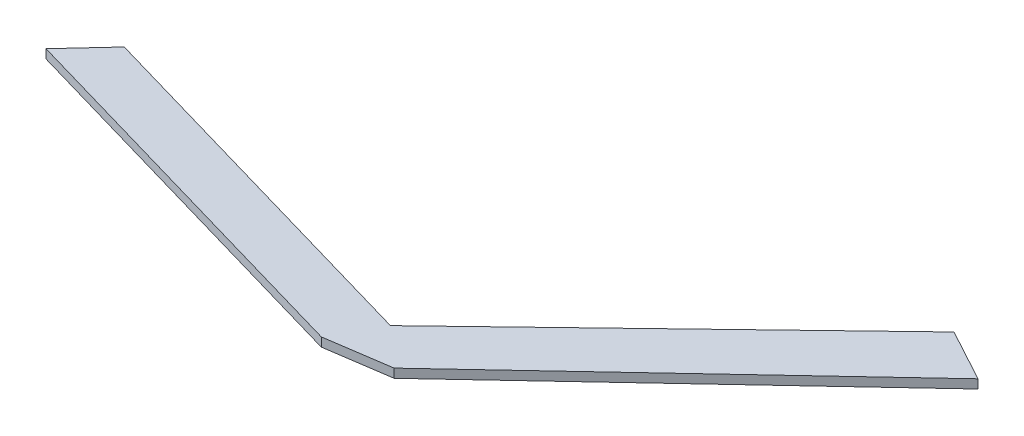
ISO-10303-21;
HEADER;
FILE_DESCRIPTION(('STEP AP214'),'2;1');
FILE_NAME('part.step','',(''),(''),'','','');
FILE_SCHEMA(('AUTOMOTIVE_DESIGN { 1 0 10303 214 1 1 1 1 }'));
ENDSEC;
DATA;
#1=APPLICATION_CONTEXT('core data for automotive mechanical design processes');
#2=APPLICATION_PROTOCOL_DEFINITION('international standard','automotive_design',2000,#1);
#3=PRODUCT_CONTEXT('',#1,'mechanical');
#4=PRODUCT('Part','Part','',(#3));
#5=PRODUCT_RELATED_PRODUCT_CATEGORY('part','',(#4));
#6=PRODUCT_DEFINITION_FORMATION('','',#4);
#7=PRODUCT_DEFINITION_CONTEXT('part definition',#1,'design');
#8=PRODUCT_DEFINITION('design','',#6,#7);
#9=PRODUCT_DEFINITION_SHAPE('','',#8);
#10=(LENGTH_UNIT() NAMED_UNIT(*) SI_UNIT(.MILLI.,.METRE.));
#11=(NAMED_UNIT(*) PLANE_ANGLE_UNIT() SI_UNIT($,.RADIAN.));
#12=(NAMED_UNIT(*) SI_UNIT($,.STERADIAN.) SOLID_ANGLE_UNIT());
#13=UNCERTAINTY_MEASURE_WITH_UNIT(LENGTH_MEASURE(1.E-05),#10,'distance_accuracy_value','');
#14=(GEOMETRIC_REPRESENTATION_CONTEXT(3) GLOBAL_UNCERTAINTY_ASSIGNED_CONTEXT((#13)) GLOBAL_UNIT_ASSIGNED_CONTEXT((#10,
#11,#12)) REPRESENTATION_CONTEXT('',''));
#15=CARTESIAN_POINT('',(0.,0.,0.));
#16=DIRECTION('',(0.,0.,1.));
#17=DIRECTION('',(1.,0.,0.));
#18=AXIS2_PLACEMENT_3D('',#15,#16,#17);
#19=CARTESIAN_POINT('',(32.4366791918596,1.,-31.1907332873785));
#20=DIRECTION('',(0.693127406386189,0.,0.720815093152436));
#21=DIRECTION('',(0.720815093152436,0.,-0.693127406386189));
#22=AXIS2_PLACEMENT_3D('',#19,#20,#21);
#23=PLANE('',#22);
#24=DIRECTION('',(-0.720815093152436,0.,0.693127406386189));
#25=VECTOR('',#24,1.);
#26=CARTESIAN_POINT('',(32.4366791918596,0.,-31.1907332873785));
#27=LINE('',#26,#25);
#28=CARTESIAN_POINT('',(32.4366791918596,0.,-31.1907332873785));
#29=VERTEX_POINT('',#28);
#30=CARTESIAN_POINT('',(0.,0.,0.));
#31=VERTEX_POINT('',#30);
#32=EDGE_CURVE('E134',#29,#31,#27,.T.);
#33=ORIENTED_EDGE('',*,*,#32,.T.);
#34=DIRECTION('',(0.,-1.,0.));
#35=VECTOR('',#34,1.);
#36=CARTESIAN_POINT('',(0.,1.,0.));
#37=LINE('',#36,#35);
#38=CARTESIAN_POINT('',(0.,1.,0.));
#39=VERTEX_POINT('',#38);
#40=EDGE_CURVE('E11',#39,#31,#37,.T.);
#41=ORIENTED_EDGE('',*,*,#40,.F.);
#42=DIRECTION('',(-0.720815093152436,0.,0.693127406386189));
#43=VECTOR('',#42,1.);
#44=CARTESIAN_POINT('',(32.4366791918596,1.,-31.1907332873785));
#45=LINE('',#44,#43);
#46=CARTESIAN_POINT('',(32.4366791918596,1.,-31.1907332873785));
#47=VERTEX_POINT('',#46);
#48=EDGE_CURVE('E153',#47,#39,#45,.T.);
#49=ORIENTED_EDGE('',*,*,#48,.F.);
#50=DIRECTION('',(0.,-1.,0.));
#51=VECTOR('',#50,1.);
#52=CARTESIAN_POINT('',(32.4366791918596,1.,-31.1907332873785));
#53=LINE('',#52,#51);
#54=EDGE_CURVE('E130',#47,#29,#53,.T.);
#55=ORIENTED_EDGE('',*,*,#54,.T.);
#56=EDGE_LOOP('',(#33,#41,#49,#55));
#57=FACE_BOUND('',#56,.T.);
#58=ADVANCED_FACE('F39',(#57),#23,.F.);
#59=CARTESIAN_POINT('',(0.,1.,0.));
#60=DIRECTION('',(-0.277680478908164,0.,0.960673488565877));
#61=DIRECTION('',(0.960673488565877,0.,0.277680478908164));
#62=AXIS2_PLACEMENT_3D('',#59,#60,#61);
#63=PLANE('',#62);
#64=DIRECTION('',(-0.960673488565877,0.,-0.277680478908164));
#65=VECTOR('',#64,1.);
#66=CARTESIAN_POINT('',(0.,0.,0.));
#67=LINE('',#66,#65);
#68=CARTESIAN_POINT('',(-42.2696334968991,0.,-12.2179410719593));
#69=VERTEX_POINT('',#68);
#70=EDGE_CURVE('E138',#31,#69,#67,.T.);
#71=ORIENTED_EDGE('',*,*,#70,.T.);
#72=DIRECTION('',(0.,-1.,0.));
#73=VECTOR('',#72,1.);
#74=CARTESIAN_POINT('',(-42.2696334968991,1.,-12.2179410719593));
#75=LINE('',#74,#73);
#76=CARTESIAN_POINT('',(-42.2696334968991,1.,-12.2179410719593));
#77=VERTEX_POINT('',#76);
#78=EDGE_CURVE('E48',#77,#69,#75,.T.);
#79=ORIENTED_EDGE('',*,*,#78,.F.);
#80=DIRECTION('',(-0.960673488565877,0.,-0.277680478908164));
#81=VECTOR('',#80,1.);
#82=CARTESIAN_POINT('',(0.,1.,0.));
#83=LINE('',#82,#81);
#84=EDGE_CURVE('E96',#39,#77,#83,.T.);
#85=ORIENTED_EDGE('',*,*,#84,.F.);
#86=ORIENTED_EDGE('',*,*,#40,.T.);
#87=EDGE_LOOP('',(#71,#79,#85,#86));
#88=FACE_BOUND('',#87,.T.);
#89=ADVANCED_FACE('F187',(#88),#63,.F.);
#90=CARTESIAN_POINT('',(-42.2696334968991,1.,-12.2179410719593));
#91=DIRECTION('',(0.733523655651934,0.,0.679663921801815));
#92=DIRECTION('',(0.679663921801815,0.,-0.733523655651934));
#93=AXIS2_PLACEMENT_3D('',#90,#91,#92);
#94=PLANE('',#93);
#95=DIRECTION('',(-0.679663921801815,0.,0.733523655651934));
#96=VECTOR('',#95,1.);
#97=CARTESIAN_POINT('',(-42.2696334968991,0.,-12.2179410719593));
#98=LINE('',#97,#96);
#99=CARTESIAN_POINT('',(-46.5175330081604,0.,-7.63341822413478));
#100=VERTEX_POINT('',#99);
#101=EDGE_CURVE('E141',#69,#100,#98,.T.);
#102=ORIENTED_EDGE('',*,*,#101,.T.);
#103=DIRECTION('',(0.,-1.,0.));
#104=VECTOR('',#103,1.);
#105=CARTESIAN_POINT('',(-46.5175330081604,1.,-7.63341822413478));
#106=LINE('',#105,#104);
#107=CARTESIAN_POINT('',(-46.5175330081604,1.,-7.63341822413478));
#108=VERTEX_POINT('',#107);
#109=EDGE_CURVE('E160',#108,#100,#106,.T.);
#110=ORIENTED_EDGE('',*,*,#109,.F.);
#111=DIRECTION('',(-0.679663921801815,0.,0.733523655651934));
#112=VECTOR('',#111,1.);
#113=CARTESIAN_POINT('',(-42.2696334968991,1.,-12.2179410719593));
#114=LINE('',#113,#112);
#115=EDGE_CURVE('E170',#77,#108,#114,.T.);
#116=ORIENTED_EDGE('',*,*,#115,.F.);
#117=ORIENTED_EDGE('',*,*,#78,.T.);
#118=EDGE_LOOP('',(#102,#110,#116,#117));
#119=FACE_BOUND('',#118,.T.);
#120=ADVANCED_FACE('F168',(#119),#94,.F.);
#121=CARTESIAN_POINT('',(-46.5175330081604,1.,-7.63341822413478));
#122=DIRECTION('',(0.277680478908164,0.,-0.960673488565877));
#123=DIRECTION('',(-0.960673488565878,0.,-0.277680478908164));
#124=AXIS2_PLACEMENT_3D('',#121,#122,#123);
#125=PLANE('',#124);
#126=DIRECTION('',(0.960673488565877,0.,0.277680478908164));
#127=VECTOR('',#126,1.);
#128=CARTESIAN_POINT('',(-46.5175330081604,0.,-7.63341822413478));
#129=LINE('',#128,#127);
#130=CARTESIAN_POINT('',(-2.80688927841294,0.,5.00104356618667));
#131=VERTEX_POINT('',#130);
#132=EDGE_CURVE('E144',#100,#131,#129,.T.);
#133=ORIENTED_EDGE('',*,*,#132,.T.);
#134=DIRECTION('',(0.,-1.,0.));
#135=VECTOR('',#134,1.);
#136=CARTESIAN_POINT('',(-2.80688927841294,1.,5.00104356618667));
#137=LINE('',#136,#135);
#138=CARTESIAN_POINT('',(-2.80688927841294,1.,5.00104356618667));
#139=VERTEX_POINT('',#138);
#140=EDGE_CURVE('E123',#139,#131,#137,.T.);
#141=ORIENTED_EDGE('',*,*,#140,.F.);
#142=DIRECTION('',(0.960673488565877,0.,0.277680478908164));
#143=VECTOR('',#142,1.);
#144=CARTESIAN_POINT('',(-46.5175330081604,1.,-7.63341822413478));
#145=LINE('',#144,#143);
#146=EDGE_CURVE('E112',#108,#139,#145,.T.);
#147=ORIENTED_EDGE('',*,*,#146,.F.);
#148=ORIENTED_EDGE('',*,*,#109,.T.);
#149=EDGE_LOOP('',(#133,#141,#147,#148));
#150=FACE_BOUND('',#149,.T.);
#151=ADVANCED_FACE('F176',(#150),#125,.F.);
#152=CARTESIAN_POINT('',(-2.80688927841294,1.,5.00104356618667));
#153=DIRECTION('',(-0.146461513389534,0.,-0.989216369201221));
#154=DIRECTION('',(-0.989216369201221,0.,0.146461513389534));
#155=AXIS2_PLACEMENT_3D('',#152,#153,#154);
#156=PLANE('',#155);
#157=DIRECTION('',(0.989216369201221,0.,-0.146461513389534));
#158=VECTOR('',#157,1.);
#159=CARTESIAN_POINT('',(-2.80688927841294,0.,5.00104356618667));
#160=LINE('',#159,#158);
#161=CARTESIAN_POINT('',(4.36492939829591,0.,3.93919759411254));
#162=VERTEX_POINT('',#161);
#163=EDGE_CURVE('E121',#131,#162,#160,.T.);
#164=ORIENTED_EDGE('',*,*,#163,.T.);
#165=DIRECTION('',(0.,-1.,0.));
#166=VECTOR('',#165,1.);
#167=CARTESIAN_POINT('',(4.36492939829591,1.,3.93919759411254));
#168=LINE('',#167,#166);
#169=CARTESIAN_POINT('',(4.36492939829591,1.,3.93919759411254));
#170=VERTEX_POINT('',#169);
#171=EDGE_CURVE('E118',#170,#162,#168,.T.);
#172=ORIENTED_EDGE('',*,*,#171,.F.);
#173=DIRECTION('',(0.989216369201221,0.,-0.146461513389534));
#174=VECTOR('',#173,1.);
#175=CARTESIAN_POINT('',(-2.80688927841294,1.,5.00104356618667));
#176=LINE('',#175,#174);
#177=EDGE_CURVE('E106',#139,#170,#176,.T.);
#178=ORIENTED_EDGE('',*,*,#177,.F.);
#179=ORIENTED_EDGE('',*,*,#140,.T.);
#180=EDGE_LOOP('',(#164,#172,#178,#179));
#181=FACE_BOUND('',#180,.T.);
#182=ADVANCED_FACE('F119',(#181),#156,.F.);
#183=CARTESIAN_POINT('',(4.36492939829591,1.,3.93919759411254));
#184=DIRECTION('',(-0.684285050171166,0.,-0.729214625547407));
#185=DIRECTION('',(-0.729214625547407,0.,0.684285050171166));
#186=AXIS2_PLACEMENT_3D('',#183,#184,#185);
#187=PLANE('',#186);
#188=DIRECTION('',(0.729214625547407,0.,-0.684285050171166));
#189=VECTOR('',#188,1.);
#190=CARTESIAN_POINT('',(4.36492939829591,0.,3.93919759411254));
#191=LINE('',#190,#189);
#192=CARTESIAN_POINT('',(38.3682073875715,0.,-27.9690142953689));
#193=VERTEX_POINT('',#192);
#194=EDGE_CURVE('E82',#162,#193,#191,.T.);
#195=ORIENTED_EDGE('',*,*,#194,.T.);
#196=DIRECTION('',(0.,-1.,0.));
#197=VECTOR('',#196,1.);
#198=CARTESIAN_POINT('',(38.3682073875715,1.,-27.9690142953689));
#199=LINE('',#198,#197);
#200=CARTESIAN_POINT('',(38.3682073875715,1.,-27.9690142953689));
#201=VERTEX_POINT('',#200);
#202=EDGE_CURVE('E124',#201,#193,#199,.T.);
#203=ORIENTED_EDGE('',*,*,#202,.F.);
#204=DIRECTION('',(0.729214625547407,0.,-0.684285050171166));
#205=VECTOR('',#204,1.);
#206=CARTESIAN_POINT('',(4.36492939829591,1.,3.93919759411254));
#207=LINE('',#206,#205);
#208=EDGE_CURVE('E110',#170,#201,#207,.T.);
#209=ORIENTED_EDGE('',*,*,#208,.F.);
#210=ORIENTED_EDGE('',*,*,#171,.T.);
#211=EDGE_LOOP('',(#195,#203,#209,#210));
#212=FACE_BOUND('',#211,.T.);
#213=ADVANCED_FACE('F126',(#212),#187,.F.);
#214=CARTESIAN_POINT('',(38.3682073875715,1.,-27.9690142953689));
#215=DIRECTION('',(-0.477291702519935,0.,0.87874491788324));
#216=DIRECTION('',(0.87874491788324,0.,0.477291702519935));
#217=AXIS2_PLACEMENT_3D('',#214,#215,#216);
#218=PLANE('',#217);
#219=DIRECTION('',(-0.87874491788324,0.,-0.477291702519935));
#220=VECTOR('',#219,1.);
#221=CARTESIAN_POINT('',(38.3682073875715,0.,-27.9690142953689));
#222=LINE('',#221,#220);
#223=EDGE_CURVE('E88',#193,#29,#222,.T.);
#224=ORIENTED_EDGE('',*,*,#223,.T.);
#225=ORIENTED_EDGE('',*,*,#54,.F.);
#226=DIRECTION('',(-0.87874491788324,0.,-0.477291702519935));
#227=VECTOR('',#226,1.);
#228=CARTESIAN_POINT('',(38.3682073875715,1.,-27.9690142953689));
#229=LINE('',#228,#227);
#230=EDGE_CURVE('E56',#201,#47,#229,.T.);
#231=ORIENTED_EDGE('',*,*,#230,.F.);
#232=ORIENTED_EDGE('',*,*,#202,.T.);
#233=EDGE_LOOP('',(#224,#225,#231,#232));
#234=FACE_BOUND('',#233,.T.);
#235=ADVANCED_FACE('F201',(#234),#218,.F.);
#236=CARTESIAN_POINT('',(0.,1.,0.));
#237=DIRECTION('',(0.,-1.,0.));
#238=DIRECTION('',(0.,0.,-1.));
#239=AXIS2_PLACEMENT_3D('',#236,#237,#238);
#240=PLANE('',#239);
#241=ORIENTED_EDGE('',*,*,#48,.T.);
#242=ORIENTED_EDGE('',*,*,#84,.T.);
#243=ORIENTED_EDGE('',*,*,#115,.T.);
#244=ORIENTED_EDGE('',*,*,#146,.T.);
#245=ORIENTED_EDGE('',*,*,#177,.T.);
#246=ORIENTED_EDGE('',*,*,#208,.T.);
#247=ORIENTED_EDGE('',*,*,#230,.T.);
#248=EDGE_LOOP('',(#241,#242,#243,#244,#245,#246,#247));
#249=FACE_BOUND('',#248,.T.);
#250=ADVANCED_FACE('F108',(#249),#240,.F.);
#251=CARTESIAN_POINT('',(0.,0.,0.));
#252=DIRECTION('',(0.,-1.,0.));
#253=DIRECTION('',(0.,0.,-1.));
#254=AXIS2_PLACEMENT_3D('',#251,#252,#253);
#255=PLANE('',#254);
#256=ORIENTED_EDGE('',*,*,#32,.F.);
#257=ORIENTED_EDGE('',*,*,#223,.F.);
#258=ORIENTED_EDGE('',*,*,#194,.F.);
#259=ORIENTED_EDGE('',*,*,#163,.F.);
#260=ORIENTED_EDGE('',*,*,#132,.F.);
#261=ORIENTED_EDGE('',*,*,#101,.F.);
#262=ORIENTED_EDGE('',*,*,#70,.F.);
#263=EDGE_LOOP('',(#256,#257,#258,#259,#260,#261,#262));
#264=FACE_BOUND('',#263,.T.);
#265=ADVANCED_FACE('F174',(#264),#255,.T.);
#266=CLOSED_SHELL('',(#58,#89,#120,#151,#182,#213,#235,#250,#265));
#267=MANIFOLD_SOLID_BREP('B2',#266);
#268=ADVANCED_BREP_SHAPE_REPRESENTATION('',(#18,#267),#14);
#269=SHAPE_DEFINITION_REPRESENTATION(#9,#268);
ENDSEC;
END-ISO-10303-21;
